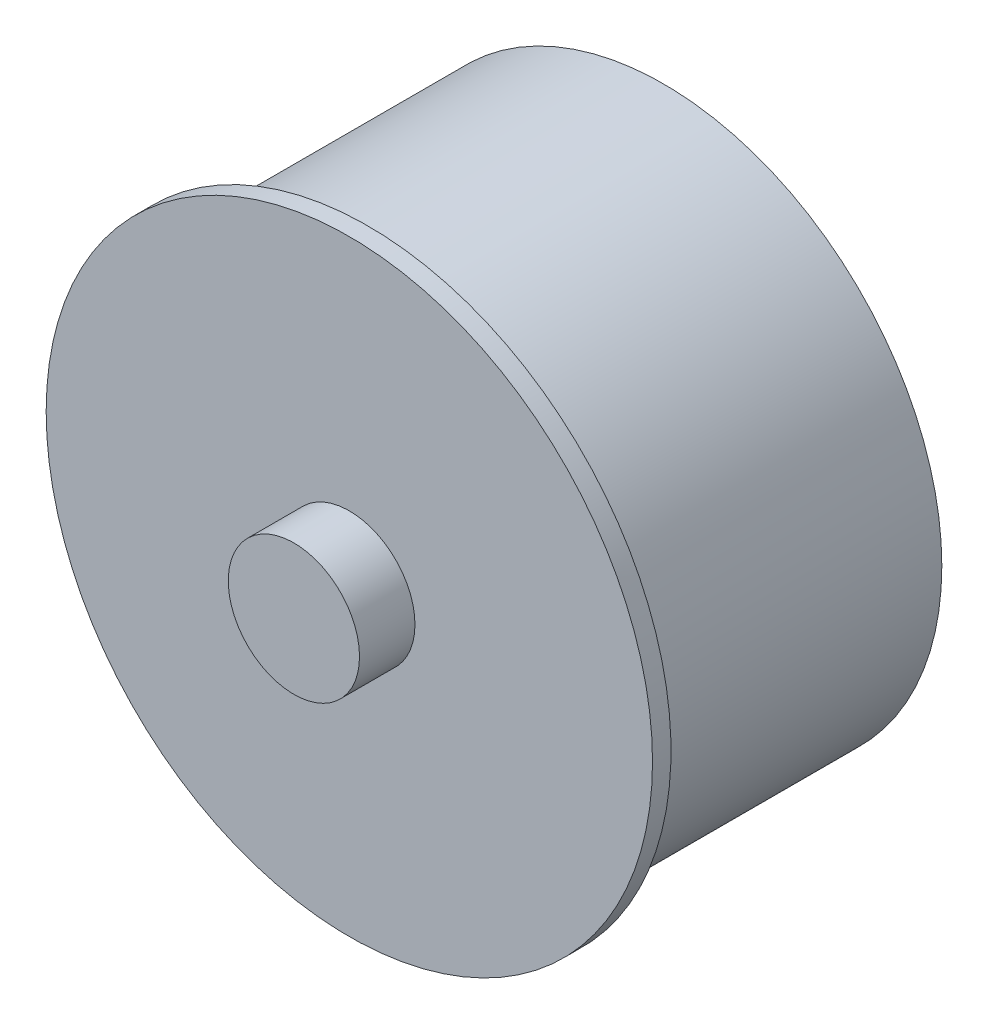
ISO-10303-21;
HEADER;
FILE_DESCRIPTION(('STEP AP214'),'2;1');
FILE_NAME('part.step','',(''),(''),'','','');
FILE_SCHEMA(('AUTOMOTIVE_DESIGN { 1 0 10303 214 1 1 1 1 }'));
ENDSEC;
DATA;
#1=APPLICATION_CONTEXT('core data for automotive mechanical design processes');
#2=APPLICATION_PROTOCOL_DEFINITION('international standard','automotive_design',2000,#1);
#3=PRODUCT_CONTEXT('',#1,'mechanical');
#4=PRODUCT('Part','Part','',(#3));
#5=PRODUCT_RELATED_PRODUCT_CATEGORY('part','',(#4));
#6=PRODUCT_DEFINITION_FORMATION('','',#4);
#7=PRODUCT_DEFINITION_CONTEXT('part definition',#1,'design');
#8=PRODUCT_DEFINITION('design','',#6,#7);
#9=PRODUCT_DEFINITION_SHAPE('','',#8);
#10=(LENGTH_UNIT() NAMED_UNIT(*) SI_UNIT(.MILLI.,.METRE.));
#11=(NAMED_UNIT(*) PLANE_ANGLE_UNIT() SI_UNIT($,.RADIAN.));
#12=(NAMED_UNIT(*) SI_UNIT($,.STERADIAN.) SOLID_ANGLE_UNIT());
#13=UNCERTAINTY_MEASURE_WITH_UNIT(LENGTH_MEASURE(1.E-05),#10,'distance_accuracy_value','');
#14=(GEOMETRIC_REPRESENTATION_CONTEXT(3) GLOBAL_UNCERTAINTY_ASSIGNED_CONTEXT((#13)) GLOBAL_UNIT_ASSIGNED_CONTEXT((#10,
#11,#12)) REPRESENTATION_CONTEXT('',''));
#15=CARTESIAN_POINT('',(0.,0.,0.));
#16=DIRECTION('',(0.,0.,1.));
#17=DIRECTION('',(1.,0.,0.));
#18=AXIS2_PLACEMENT_3D('',#15,#16,#17);
#19=CARTESIAN_POINT('',(0.,0.,-2.));
#20=DIRECTION('',(0.,0.,1.));
#21=DIRECTION('',(1.,0.,0.));
#22=AXIS2_PLACEMENT_3D('',#19,#20,#21);
#23=CYLINDRICAL_SURFACE('',#22,10.075);
#24=CARTESIAN_POINT('',(0.,0.,-2.));
#25=DIRECTION('',(0.,0.,-1.));
#26=DIRECTION('',(-1.,0.,0.));
#27=AXIS2_PLACEMENT_3D('',#24,#25,#26);
#28=CIRCLE('',#27,10.075);
#29=CARTESIAN_POINT('',(-10.075,0.,-2.));
#30=VERTEX_POINT('',#29);
#31=EDGE_CURVE('E11',#30,#30,#28,.T.);
#32=ORIENTED_EDGE('',*,*,#31,.F.);
#33=EDGE_LOOP('',(#32));
#34=FACE_BOUND('',#33,.T.);
#35=CARTESIAN_POINT('',(0.,0.,0.));
#36=DIRECTION('',(0.,0.,-1.));
#37=DIRECTION('',(-1.,0.,0.));
#38=AXIS2_PLACEMENT_3D('',#35,#36,#37);
#39=CIRCLE('',#38,10.075);
#40=CARTESIAN_POINT('',(-10.075,0.,0.));
#41=VERTEX_POINT('',#40);
#42=EDGE_CURVE('E49',#41,#41,#39,.T.);
#43=ORIENTED_EDGE('',*,*,#42,.T.);
#44=EDGE_LOOP('',(#43));
#45=FACE_BOUND('',#44,.T.);
#46=ADVANCED_FACE('F42',(#34,#45),#23,.T.);
#47=CARTESIAN_POINT('',(0.,0.,-2.));
#48=DIRECTION('',(0.,0.,-1.));
#49=DIRECTION('',(-1.,0.,0.));
#50=AXIS2_PLACEMENT_3D('',#47,#48,#49);
#51=PLANE('',#50);
#52=CARTESIAN_POINT('',(0.,8.,-2.));
#53=DIRECTION('',(0.,0.,-1.));
#54=DIRECTION('',(-1.,0.,0.));
#55=AXIS2_PLACEMENT_3D('',#52,#53,#54);
#56=CIRCLE('',#55,1.05);
#57=CARTESIAN_POINT('',(-1.05,8.,-2.));
#58=VERTEX_POINT('',#57);
#59=EDGE_CURVE('E63',#58,#58,#56,.T.);
#60=ORIENTED_EDGE('',*,*,#59,.F.);
#61=EDGE_LOOP('',(#60));
#62=FACE_BOUND('',#61,.T.);
#63=CARTESIAN_POINT('',(-8.,0.,-2.));
#64=DIRECTION('',(0.,0.,-1.));
#65=DIRECTION('',(-1.,0.,0.));
#66=AXIS2_PLACEMENT_3D('',#63,#64,#65);
#67=CIRCLE('',#66,1.05);
#68=CARTESIAN_POINT('',(-9.05,0.,-2.));
#69=VERTEX_POINT('',#68);
#70=EDGE_CURVE('E119',#69,#69,#67,.T.);
#71=ORIENTED_EDGE('',*,*,#70,.F.);
#72=EDGE_LOOP('',(#71));
#73=FACE_BOUND('',#72,.T.);
#74=CARTESIAN_POINT('',(0.,-8.,-2.));
#75=DIRECTION('',(0.,0.,-1.));
#76=DIRECTION('',(-1.,0.,0.));
#77=AXIS2_PLACEMENT_3D('',#74,#75,#76);
#78=CIRCLE('',#77,1.05);
#79=CARTESIAN_POINT('',(-1.04999999999994,-8.,-2.));
#80=VERTEX_POINT('',#79);
#81=EDGE_CURVE('E112',#80,#80,#78,.T.);
#82=ORIENTED_EDGE('',*,*,#81,.F.);
#83=EDGE_LOOP('',(#82));
#84=FACE_BOUND('',#83,.T.);
#85=CARTESIAN_POINT('',(8.,0.,-2.));
#86=DIRECTION('',(0.,0.,-1.));
#87=DIRECTION('',(-1.,0.,0.));
#88=AXIS2_PLACEMENT_3D('',#85,#86,#87);
#89=CIRCLE('',#88,1.05);
#90=CARTESIAN_POINT('',(6.95,0.,-2.));
#91=VERTEX_POINT('',#90);
#92=EDGE_CURVE('E56',#91,#91,#89,.T.);
#93=ORIENTED_EDGE('',*,*,#92,.F.);
#94=EDGE_LOOP('',(#93));
#95=FACE_BOUND('',#94,.T.);
#96=ORIENTED_EDGE('',*,*,#31,.T.);
#97=EDGE_LOOP('',(#96));
#98=FACE_BOUND('',#97,.T.);
#99=ADVANCED_FACE('F87',(#62,#73,#84,#95,#98),#51,.T.);
#100=CARTESIAN_POINT('',(0.,0.,0.));
#101=DIRECTION('',(0.,0.,-1.));
#102=DIRECTION('',(-1.,0.,0.));
#103=AXIS2_PLACEMENT_3D('',#100,#101,#102);
#104=PLANE('',#103);
#105=CARTESIAN_POINT('',(0.,8.,0.));
#106=DIRECTION('',(0.,0.,-1.));
#107=DIRECTION('',(-1.,0.,0.));
#108=AXIS2_PLACEMENT_3D('',#105,#106,#107);
#109=CIRCLE('',#108,1.05);
#110=CARTESIAN_POINT('',(-1.05,8.,0.));
#111=VERTEX_POINT('',#110);
#112=EDGE_CURVE('E45',#111,#111,#109,.T.);
#113=ORIENTED_EDGE('',*,*,#112,.T.);
#114=EDGE_LOOP('',(#113));
#115=FACE_BOUND('',#114,.T.);
#116=CARTESIAN_POINT('',(-8.,0.,0.));
#117=DIRECTION('',(0.,0.,-1.));
#118=DIRECTION('',(-1.,0.,0.));
#119=AXIS2_PLACEMENT_3D('',#116,#117,#118);
#120=CIRCLE('',#119,1.05);
#121=CARTESIAN_POINT('',(-9.05,0.,0.));
#122=VERTEX_POINT('',#121);
#123=EDGE_CURVE('E65',#122,#122,#120,.T.);
#124=ORIENTED_EDGE('',*,*,#123,.T.);
#125=EDGE_LOOP('',(#124));
#126=FACE_BOUND('',#125,.T.);
#127=CARTESIAN_POINT('',(0.,-8.,0.));
#128=DIRECTION('',(0.,0.,-1.));
#129=DIRECTION('',(-1.,0.,0.));
#130=AXIS2_PLACEMENT_3D('',#127,#128,#129);
#131=CIRCLE('',#130,1.05);
#132=CARTESIAN_POINT('',(-1.04999999999994,-8.,0.));
#133=VERTEX_POINT('',#132);
#134=EDGE_CURVE('E62',#133,#133,#131,.T.);
#135=ORIENTED_EDGE('',*,*,#134,.T.);
#136=EDGE_LOOP('',(#135));
#137=FACE_BOUND('',#136,.T.);
#138=CARTESIAN_POINT('',(8.,0.,0.));
#139=DIRECTION('',(0.,0.,-1.));
#140=DIRECTION('',(-1.,0.,0.));
#141=AXIS2_PLACEMENT_3D('',#138,#139,#140);
#142=CIRCLE('',#141,1.05);
#143=CARTESIAN_POINT('',(6.95,0.,0.));
#144=VERTEX_POINT('',#143);
#145=EDGE_CURVE('E59',#144,#144,#142,.T.);
#146=ORIENTED_EDGE('',*,*,#145,.T.);
#147=EDGE_LOOP('',(#146));
#148=FACE_BOUND('',#147,.T.);
#149=ORIENTED_EDGE('',*,*,#42,.F.);
#150=EDGE_LOOP('',(#149));
#151=FACE_BOUND('',#150,.T.);
#152=ADVANCED_FACE('F72',(#115,#126,#137,#148,#151),#104,.F.);
#153=CARTESIAN_POINT('',(8.,0.,8.));
#154=DIRECTION('',(0.,0.,-1.));
#155=DIRECTION('',(-1.,0.,0.));
#156=AXIS2_PLACEMENT_3D('',#153,#154,#155);
#157=CYLINDRICAL_SURFACE('',#156,1.05);
#158=ORIENTED_EDGE('',*,*,#92,.T.);
#159=EDGE_LOOP('',(#158));
#160=FACE_BOUND('',#159,.T.);
#161=ORIENTED_EDGE('',*,*,#145,.F.);
#162=EDGE_LOOP('',(#161));
#163=FACE_BOUND('',#162,.T.);
#164=ADVANCED_FACE('F98',(#160,#163),#157,.F.);
#165=CARTESIAN_POINT('',(0.,-8.,8.));
#166=DIRECTION('',(0.,0.,-1.));
#167=DIRECTION('',(-1.,0.,0.));
#168=AXIS2_PLACEMENT_3D('',#165,#166,#167);
#169=CYLINDRICAL_SURFACE('',#168,1.05);
#170=ORIENTED_EDGE('',*,*,#81,.T.);
#171=EDGE_LOOP('',(#170));
#172=FACE_BOUND('',#171,.T.);
#173=ORIENTED_EDGE('',*,*,#134,.F.);
#174=EDGE_LOOP('',(#173));
#175=FACE_BOUND('',#174,.T.);
#176=ADVANCED_FACE('F82',(#172,#175),#169,.F.);
#177=CARTESIAN_POINT('',(-8.,0.,8.));
#178=DIRECTION('',(0.,0.,-1.));
#179=DIRECTION('',(-1.,0.,0.));
#180=AXIS2_PLACEMENT_3D('',#177,#178,#179);
#181=CYLINDRICAL_SURFACE('',#180,1.05);
#182=ORIENTED_EDGE('',*,*,#70,.T.);
#183=EDGE_LOOP('',(#182));
#184=FACE_BOUND('',#183,.T.);
#185=ORIENTED_EDGE('',*,*,#123,.F.);
#186=EDGE_LOOP('',(#185));
#187=FACE_BOUND('',#186,.T.);
#188=ADVANCED_FACE('F76',(#184,#187),#181,.F.);
#189=CARTESIAN_POINT('',(0.,8.,8.));
#190=DIRECTION('',(0.,0.,-1.));
#191=DIRECTION('',(-1.,0.,0.));
#192=AXIS2_PLACEMENT_3D('',#189,#190,#191);
#193=CYLINDRICAL_SURFACE('',#192,1.05);
#194=ORIENTED_EDGE('',*,*,#59,.T.);
#195=EDGE_LOOP('',(#194));
#196=FACE_BOUND('',#195,.T.);
#197=ORIENTED_EDGE('',*,*,#112,.F.);
#198=EDGE_LOOP('',(#197));
#199=FACE_BOUND('',#198,.T.);
#200=ADVANCED_FACE('F74',(#196,#199),#193,.F.);
#201=CLOSED_SHELL('',(#46,#99,#152,#164,#176,#188,#200));
#202=MANIFOLD_SOLID_BREP('B2',#201);
#203=CARTESIAN_POINT('',(0.,0.,17.));
#204=DIRECTION('',(0.,0.,-1.));
#205=DIRECTION('',(-1.,0.,0.));
#206=AXIS2_PLACEMENT_3D('',#203,#204,#205);
#207=CYLINDRICAL_SURFACE('',#206,16.4);
#208=CARTESIAN_POINT('',(0.,0.,17.));
#209=DIRECTION('',(0.,0.,1.));
#210=DIRECTION('',(1.,0.,0.));
#211=AXIS2_PLACEMENT_3D('',#208,#209,#210);
#212=CIRCLE('',#211,16.4);
#213=CARTESIAN_POINT('',(16.4,0.,17.));
#214=VERTEX_POINT('',#213);
#215=EDGE_CURVE('E173',#214,#214,#212,.T.);
#216=ORIENTED_EDGE('',*,*,#215,.F.);
#217=EDGE_LOOP('',(#216));
#218=FACE_BOUND('',#217,.T.);
#219=CARTESIAN_POINT('',(0.,0.,16.));
#220=DIRECTION('',(0.,0.,-1.));
#221=DIRECTION('',(-1.,0.,0.));
#222=AXIS2_PLACEMENT_3D('',#219,#220,#221);
#223=CIRCLE('',#222,16.4);
#224=CARTESIAN_POINT('',(-16.4,0.,16.));
#225=VERTEX_POINT('',#224);
#226=EDGE_CURVE('E221',#225,#225,#223,.T.);
#227=ORIENTED_EDGE('',*,*,#226,.F.);
#228=EDGE_LOOP('',(#227));
#229=FACE_BOUND('',#228,.T.);
#230=ADVANCED_FACE('F166',(#218,#229),#207,.T.);
#231=CARTESIAN_POINT('',(0.,0.,17.));
#232=DIRECTION('',(0.,0.,1.));
#233=DIRECTION('',(1.,0.,0.));
#234=AXIS2_PLACEMENT_3D('',#231,#232,#233);
#235=PLANE('',#234);
#236=CARTESIAN_POINT('',(0.,0.,17.));
#237=DIRECTION('',(0.,0.,1.));
#238=DIRECTION('',(1.,0.,0.));
#239=AXIS2_PLACEMENT_3D('',#236,#237,#238);
#240=CIRCLE('',#239,3.55);
#241=CARTESIAN_POINT('',(3.55,0.,17.));
#242=VERTEX_POINT('',#241);
#243=EDGE_CURVE('E41',#242,#242,#240,.T.);
#244=ORIENTED_EDGE('',*,*,#243,.F.);
#245=EDGE_LOOP('',(#244));
#246=FACE_BOUND('',#245,.T.);
#247=ORIENTED_EDGE('',*,*,#215,.T.);
#248=EDGE_LOOP('',(#247));
#249=FACE_BOUND('',#248,.T.);
#250=ADVANCED_FACE('F203',(#246,#249),#235,.T.);
#251=CARTESIAN_POINT('',(0.,0.,20.));
#252=DIRECTION('',(0.,0.,-1.));
#253=DIRECTION('',(-1.,0.,0.));
#254=AXIS2_PLACEMENT_3D('',#251,#252,#253);
#255=CYLINDRICAL_SURFACE('',#254,3.55);
#256=CARTESIAN_POINT('',(0.,0.,20.));
#257=DIRECTION('',(0.,0.,1.));
#258=DIRECTION('',(1.,0.,0.));
#259=AXIS2_PLACEMENT_3D('',#256,#257,#258);
#260=CIRCLE('',#259,3.55);
#261=CARTESIAN_POINT('',(3.55,0.,20.));
#262=VERTEX_POINT('',#261);
#263=EDGE_CURVE('E178',#262,#262,#260,.T.);
#264=ORIENTED_EDGE('',*,*,#263,.F.);
#265=EDGE_LOOP('',(#264));
#266=FACE_BOUND('',#265,.T.);
#267=ORIENTED_EDGE('',*,*,#243,.T.);
#268=EDGE_LOOP('',(#267));
#269=FACE_BOUND('',#268,.T.);
#270=ADVANCED_FACE('F201',(#266,#269),#255,.T.);
#271=CARTESIAN_POINT('',(0.,0.,20.));
#272=DIRECTION('',(0.,0.,1.));
#273=DIRECTION('',(1.,0.,0.));
#274=AXIS2_PLACEMENT_3D('',#271,#272,#273);
#275=PLANE('',#274);
#276=ORIENTED_EDGE('',*,*,#263,.T.);
#277=EDGE_LOOP('',(#276));
#278=FACE_BOUND('',#277,.T.);
#279=ADVANCED_FACE('F199',(#278),#275,.T.);
#280=CARTESIAN_POINT('',(0.,0.,16.));
#281=DIRECTION('',(0.,0.,-1.));
#282=DIRECTION('',(-1.,0.,0.));
#283=AXIS2_PLACEMENT_3D('',#280,#281,#282);
#284=PLANE('',#283);
#285=CARTESIAN_POINT('',(0.,0.,16.));
#286=DIRECTION('',(0.,0.,-1.));
#287=DIRECTION('',(-1.,0.,0.));
#288=AXIS2_PLACEMENT_3D('',#285,#286,#287);
#289=CIRCLE('',#288,15.05);
#290=CARTESIAN_POINT('',(-15.05,0.,16.));
#291=VERTEX_POINT('',#290);
#292=EDGE_CURVE('E224',#291,#291,#289,.T.);
#293=ORIENTED_EDGE('',*,*,#292,.F.);
#294=EDGE_LOOP('',(#293));
#295=FACE_BOUND('',#294,.T.);
#296=ORIENTED_EDGE('',*,*,#226,.T.);
#297=EDGE_LOOP('',(#296));
#298=FACE_BOUND('',#297,.T.);
#299=ADVANCED_FACE('F209',(#295,#298),#284,.T.);
#300=CARTESIAN_POINT('',(0.,0.,16.));
#301=DIRECTION('',(0.,0.,-1.));
#302=DIRECTION('',(-1.,0.,0.));
#303=AXIS2_PLACEMENT_3D('',#300,#301,#302);
#304=CYLINDRICAL_SURFACE('',#303,15.05);
#305=ORIENTED_EDGE('',*,*,#292,.T.);
#306=EDGE_LOOP('',(#305));
#307=FACE_BOUND('',#306,.T.);
#308=CARTESIAN_POINT('',(0.,0.,0.));
#309=DIRECTION('',(0.,0.,-1.));
#310=DIRECTION('',(-1.,0.,0.));
#311=AXIS2_PLACEMENT_3D('',#308,#309,#310);
#312=CIRCLE('',#311,15.05);
#313=CARTESIAN_POINT('',(-15.05,0.,0.));
#314=VERTEX_POINT('',#313);
#315=EDGE_CURVE('E229',#314,#314,#312,.T.);
#316=ORIENTED_EDGE('',*,*,#315,.F.);
#317=EDGE_LOOP('',(#316));
#318=FACE_BOUND('',#317,.T.);
#319=ADVANCED_FACE('F258',(#307,#318),#304,.T.);
#320=CARTESIAN_POINT('',(0.,0.,8.));
#321=DIRECTION('',(0.,0.,-1.));
#322=DIRECTION('',(-1.,0.,0.));
#323=AXIS2_PLACEMENT_3D('',#320,#321,#322);
#324=PLANE('',#323);
#325=CARTESIAN_POINT('',(0.,8.,8.));
#326=DIRECTION('',(0.,0.,-1.));
#327=DIRECTION('',(-1.,0.,0.));
#328=AXIS2_PLACEMENT_3D('',#325,#326,#327);
#329=CIRCLE('',#328,1.05);
#330=CARTESIAN_POINT('',(-1.05,8.,8.));
#331=VERTEX_POINT('',#330);
#332=EDGE_CURVE('E187',#331,#331,#329,.T.);
#333=ORIENTED_EDGE('',*,*,#332,.T.);
#334=EDGE_LOOP('',(#333));
#335=FACE_BOUND('',#334,.T.);
#336=ADVANCED_FACE('F260',(#335),#324,.T.);
#337=CARTESIAN_POINT('',(0.,0.,8.));
#338=DIRECTION('',(0.,0.,-1.));
#339=DIRECTION('',(-1.,0.,0.));
#340=AXIS2_PLACEMENT_3D('',#337,#338,#339);
#341=PLANE('',#340);
#342=CARTESIAN_POINT('',(-8.,0.,8.));
#343=DIRECTION('',(0.,0.,-1.));
#344=DIRECTION('',(-1.,0.,0.));
#345=AXIS2_PLACEMENT_3D('',#342,#343,#344);
#346=CIRCLE('',#345,1.05);
#347=CARTESIAN_POINT('',(-9.05,0.,8.));
#348=VERTEX_POINT('',#347);
#349=EDGE_CURVE('E235',#348,#348,#346,.T.);
#350=ORIENTED_EDGE('',*,*,#349,.T.);
#351=EDGE_LOOP('',(#350));
#352=FACE_BOUND('',#351,.T.);
#353=ADVANCED_FACE('F267',(#352),#341,.T.);
#354=CARTESIAN_POINT('',(0.,0.,8.));
#355=DIRECTION('',(0.,0.,-1.));
#356=DIRECTION('',(-1.,0.,0.));
#357=AXIS2_PLACEMENT_3D('',#354,#355,#356);
#358=PLANE('',#357);
#359=CARTESIAN_POINT('',(0.,-8.,8.));
#360=DIRECTION('',(0.,0.,-1.));
#361=DIRECTION('',(-1.,0.,0.));
#362=AXIS2_PLACEMENT_3D('',#359,#360,#361);
#363=CIRCLE('',#362,1.05);
#364=CARTESIAN_POINT('',(-1.04999999999994,-8.,8.));
#365=VERTEX_POINT('',#364);
#366=EDGE_CURVE('E227',#365,#365,#363,.T.);
#367=ORIENTED_EDGE('',*,*,#366,.T.);
#368=EDGE_LOOP('',(#367));
#369=FACE_BOUND('',#368,.T.);
#370=ADVANCED_FACE('F241',(#369),#358,.T.);
#371=CARTESIAN_POINT('',(0.,0.,8.));
#372=DIRECTION('',(0.,0.,-1.));
#373=DIRECTION('',(-1.,0.,0.));
#374=AXIS2_PLACEMENT_3D('',#371,#372,#373);
#375=PLANE('',#374);
#376=CARTESIAN_POINT('',(8.,0.,8.));
#377=DIRECTION('',(0.,0.,-1.));
#378=DIRECTION('',(-1.,0.,0.));
#379=AXIS2_PLACEMENT_3D('',#376,#377,#378);
#380=CIRCLE('',#379,1.05);
#381=CARTESIAN_POINT('',(6.95,0.,8.));
#382=VERTEX_POINT('',#381);
#383=EDGE_CURVE('E223',#382,#382,#380,.T.);
#384=ORIENTED_EDGE('',*,*,#383,.T.);
#385=EDGE_LOOP('',(#384));
#386=FACE_BOUND('',#385,.T.);
#387=ADVANCED_FACE('F276',(#386),#375,.T.);
#388=CARTESIAN_POINT('',(0.,8.,8.));
#389=DIRECTION('',(0.,0.,-1.));
#390=DIRECTION('',(-1.,0.,0.));
#391=AXIS2_PLACEMENT_3D('',#388,#389,#390);
#392=CYLINDRICAL_SURFACE('',#391,1.05);
#393=ORIENTED_EDGE('',*,*,#332,.F.);
#394=EDGE_LOOP('',(#393));
#395=FACE_BOUND('',#394,.T.);
#396=CARTESIAN_POINT('',(0.,8.,0.));
#397=DIRECTION('',(0.,0.,1.));
#398=DIRECTION('',(1.,0.,0.));
#399=AXIS2_PLACEMENT_3D('',#396,#397,#398);
#400=CIRCLE('',#399,1.05);
#401=CARTESIAN_POINT('',(1.05,8.,0.));
#402=VERTEX_POINT('',#401);
#403=EDGE_CURVE('E169',#402,#402,#400,.T.);
#404=ORIENTED_EDGE('',*,*,#403,.F.);
#405=EDGE_LOOP('',(#404));
#406=FACE_BOUND('',#405,.T.);
#407=ADVANCED_FACE('F273',(#395,#406),#392,.F.);
#408=CARTESIAN_POINT('',(-8.,0.,8.));
#409=DIRECTION('',(0.,0.,-1.));
#410=DIRECTION('',(-1.,0.,0.));
#411=AXIS2_PLACEMENT_3D('',#408,#409,#410);
#412=CYLINDRICAL_SURFACE('',#411,1.05);
#413=ORIENTED_EDGE('',*,*,#349,.F.);
#414=EDGE_LOOP('',(#413));
#415=FACE_BOUND('',#414,.T.);
#416=CARTESIAN_POINT('',(-8.,0.,0.));
#417=DIRECTION('',(0.,0.,1.));
#418=DIRECTION('',(1.,0.,0.));
#419=AXIS2_PLACEMENT_3D('',#416,#417,#418);
#420=CIRCLE('',#419,1.05);
#421=CARTESIAN_POINT('',(-6.95,0.,0.));
#422=VERTEX_POINT('',#421);
#423=EDGE_CURVE('E189',#422,#422,#420,.T.);
#424=ORIENTED_EDGE('',*,*,#423,.F.);
#425=EDGE_LOOP('',(#424));
#426=FACE_BOUND('',#425,.T.);
#427=ADVANCED_FACE('F247',(#415,#426),#412,.F.);
#428=CARTESIAN_POINT('',(0.,-8.,8.));
#429=DIRECTION('',(0.,0.,-1.));
#430=DIRECTION('',(-1.,0.,0.));
#431=AXIS2_PLACEMENT_3D('',#428,#429,#430);
#432=CYLINDRICAL_SURFACE('',#431,1.05);
#433=ORIENTED_EDGE('',*,*,#366,.F.);
#434=EDGE_LOOP('',(#433));
#435=FACE_BOUND('',#434,.T.);
#436=CARTESIAN_POINT('',(0.,-8.,0.));
#437=DIRECTION('',(0.,0.,1.));
#438=DIRECTION('',(1.,0.,0.));
#439=AXIS2_PLACEMENT_3D('',#436,#437,#438);
#440=CIRCLE('',#439,1.05);
#441=CARTESIAN_POINT('',(1.05000000000006,-8.,0.));
#442=VERTEX_POINT('',#441);
#443=EDGE_CURVE('E186',#442,#442,#440,.T.);
#444=ORIENTED_EDGE('',*,*,#443,.F.);
#445=EDGE_LOOP('',(#444));
#446=FACE_BOUND('',#445,.T.);
#447=ADVANCED_FACE('F243',(#435,#446),#432,.F.);
#448=CARTESIAN_POINT('',(8.,0.,8.));
#449=DIRECTION('',(0.,0.,-1.));
#450=DIRECTION('',(-1.,0.,0.));
#451=AXIS2_PLACEMENT_3D('',#448,#449,#450);
#452=CYLINDRICAL_SURFACE('',#451,1.05);
#453=ORIENTED_EDGE('',*,*,#383,.F.);
#454=EDGE_LOOP('',(#453));
#455=FACE_BOUND('',#454,.T.);
#456=CARTESIAN_POINT('',(8.,0.,0.));
#457=DIRECTION('',(0.,0.,1.));
#458=DIRECTION('',(1.,0.,0.));
#459=AXIS2_PLACEMENT_3D('',#456,#457,#458);
#460=CIRCLE('',#459,1.05);
#461=CARTESIAN_POINT('',(9.05,0.,0.));
#462=VERTEX_POINT('',#461);
#463=EDGE_CURVE('E183',#462,#462,#460,.T.);
#464=ORIENTED_EDGE('',*,*,#463,.F.);
#465=EDGE_LOOP('',(#464));
#466=FACE_BOUND('',#465,.T.);
#467=ADVANCED_FACE('F246',(#455,#466),#452,.F.);
#468=CARTESIAN_POINT('',(0.,0.,0.));
#469=DIRECTION('',(0.,0.,1.));
#470=DIRECTION('',(1.,0.,0.));
#471=AXIS2_PLACEMENT_3D('',#468,#469,#470);
#472=PLANE('',#471);
#473=ORIENTED_EDGE('',*,*,#463,.T.);
#474=EDGE_LOOP('',(#473));
#475=FACE_BOUND('',#474,.T.);
#476=ORIENTED_EDGE('',*,*,#443,.T.);
#477=EDGE_LOOP('',(#476));
#478=FACE_BOUND('',#477,.T.);
#479=ORIENTED_EDGE('',*,*,#423,.T.);
#480=EDGE_LOOP('',(#479));
#481=FACE_BOUND('',#480,.T.);
#482=ORIENTED_EDGE('',*,*,#403,.T.);
#483=EDGE_LOOP('',(#482));
#484=FACE_BOUND('',#483,.T.);
#485=ORIENTED_EDGE('',*,*,#315,.T.);
#486=EDGE_LOOP('',(#485));
#487=FACE_BOUND('',#486,.T.);
#488=ADVANCED_FACE('F251',(#475,#478,#481,#484,#487),#472,.F.);
#489=CLOSED_SHELL('',(#230,#250,#270,#279,#299,#319,#336,#353,#370,#387,#407,#427,#447,#467,#488));
#490=MANIFOLD_SOLID_BREP('B6',#489);
#491=ADVANCED_BREP_SHAPE_REPRESENTATION('',(#18,#202,#490),#14);
#492=SHAPE_DEFINITION_REPRESENTATION(#9,#491);
ENDSEC;
END-ISO-10303-21;
